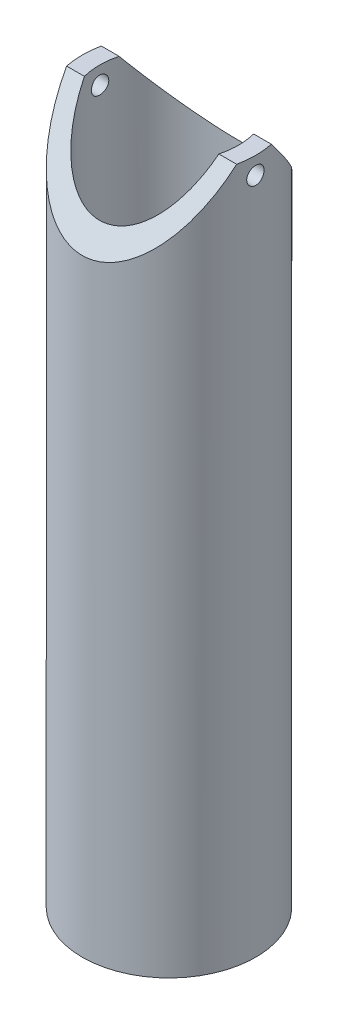
ISO-10303-21;
HEADER;
FILE_DESCRIPTION(('STEP AP214'),'2;1');
FILE_NAME('part.step','',(''),(''),'','','');
FILE_SCHEMA(('AUTOMOTIVE_DESIGN { 1 0 10303 214 1 1 1 1 }'));
ENDSEC;
DATA;
#1=APPLICATION_CONTEXT('core data for automotive mechanical design processes');
#2=APPLICATION_PROTOCOL_DEFINITION('international standard','automotive_design',2000,#1);
#3=PRODUCT_CONTEXT('',#1,'mechanical');
#4=PRODUCT('Part','Part','',(#3));
#5=PRODUCT_RELATED_PRODUCT_CATEGORY('part','',(#4));
#6=PRODUCT_DEFINITION_FORMATION('','',#4);
#7=PRODUCT_DEFINITION_CONTEXT('part definition',#1,'design');
#8=PRODUCT_DEFINITION('design','',#6,#7);
#9=PRODUCT_DEFINITION_SHAPE('','',#8);
#10=(LENGTH_UNIT() NAMED_UNIT(*) SI_UNIT(.MILLI.,.METRE.));
#11=(NAMED_UNIT(*) PLANE_ANGLE_UNIT() SI_UNIT($,.RADIAN.));
#12=(NAMED_UNIT(*) SI_UNIT($,.STERADIAN.) SOLID_ANGLE_UNIT());
#13=UNCERTAINTY_MEASURE_WITH_UNIT(LENGTH_MEASURE(1.E-05),#10,'distance_accuracy_value','');
#14=(GEOMETRIC_REPRESENTATION_CONTEXT(3) GLOBAL_UNCERTAINTY_ASSIGNED_CONTEXT((#13)) GLOBAL_UNIT_ASSIGNED_CONTEXT((#10,
#11,#12)) REPRESENTATION_CONTEXT('',''));
#15=CARTESIAN_POINT('',(0.,0.,0.));
#16=DIRECTION('',(0.,0.,1.));
#17=DIRECTION('',(1.,0.,0.));
#18=AXIS2_PLACEMENT_3D('',#15,#16,#17);
#19=CARTESIAN_POINT('',(0.,200.,0.));
#20=DIRECTION('',(0.,1.,0.));
#21=DIRECTION('',(0.,0.,1.));
#22=AXIS2_PLACEMENT_3D('',#19,#20,#21);
#23=PLANE('',#22);
#24=CARTESIAN_POINT('',(0.,200.,0.));
#25=DIRECTION('',(0.,1.,0.));
#26=DIRECTION('',(0.,0.,1.));
#27=AXIS2_PLACEMENT_3D('',#24,#25,#26);
#28=CIRCLE('',#27,25.);
#29=CARTESIAN_POINT('',(-24.4948974278317,200.,-5.));
#30=VERTEX_POINT('',#29);
#31=CARTESIAN_POINT('',(-24.4948974278318,200.,5.));
#32=VERTEX_POINT('',#31);
#33=EDGE_CURVE('E91',#30,#32,#28,.T.);
#34=ORIENTED_EDGE('',*,*,#33,.T.);
#35=DIRECTION('',(-1.,0.,0.));
#36=VECTOR('',#35,1.);
#37=CARTESIAN_POINT('',(200.,200.,5.));
#38=LINE('',#37,#36);
#39=CARTESIAN_POINT('',(-19.3649167310371,200.,5.));
#40=VERTEX_POINT('',#39);
#41=EDGE_CURVE('E100',#40,#32,#38,.T.);
#42=ORIENTED_EDGE('',*,*,#41,.F.);
#43=CARTESIAN_POINT('',(0.,200.,0.));
#44=DIRECTION('',(0.,1.,0.));
#45=DIRECTION('',(0.,0.,1.));
#46=AXIS2_PLACEMENT_3D('',#43,#44,#45);
#47=CIRCLE('',#46,20.);
#48=CARTESIAN_POINT('',(-19.3649167310371,200.,-5.));
#49=VERTEX_POINT('',#48);
#50=EDGE_CURVE('E143',#49,#40,#47,.T.);
#51=ORIENTED_EDGE('',*,*,#50,.F.);
#52=DIRECTION('',(-1.,0.,0.));
#53=VECTOR('',#52,1.);
#54=CARTESIAN_POINT('',(200.,200.,-5.));
#55=LINE('',#54,#53);
#56=EDGE_CURVE('E60',#49,#30,#55,.T.);
#57=ORIENTED_EDGE('',*,*,#56,.T.);
#58=EDGE_LOOP('',(#34,#42,#51,#57));
#59=FACE_BOUND('',#58,.T.);
#60=ADVANCED_FACE('F37',(#59),#23,.T.);
#61=CARTESIAN_POINT('',(19.3649167310371,200.,5.));
#62=VERTEX_POINT('',#61);
#63=CARTESIAN_POINT('',(19.3649167310371,200.,-5.));
#64=VERTEX_POINT('',#63);
#65=EDGE_CURVE('E111',#62,#64,#47,.T.);
#66=ORIENTED_EDGE('',*,*,#65,.F.);
#67=CARTESIAN_POINT('',(24.4948974278318,200.,5.));
#68=VERTEX_POINT('',#67);
#69=EDGE_CURVE('E68',#68,#62,#38,.T.);
#70=ORIENTED_EDGE('',*,*,#69,.F.);
#71=CARTESIAN_POINT('',(24.4948974278318,200.,-5.));
#72=VERTEX_POINT('',#71);
#73=EDGE_CURVE('E89',#68,#72,#28,.T.);
#74=ORIENTED_EDGE('',*,*,#73,.T.);
#75=EDGE_CURVE('E95',#72,#64,#55,.T.);
#76=ORIENTED_EDGE('',*,*,#75,.T.);
#77=EDGE_LOOP('',(#66,#70,#74,#76));
#78=FACE_BOUND('',#77,.T.);
#79=ADVANCED_FACE('F102',(#78),#23,.T.);
#80=CARTESIAN_POINT('',(0.,200.,0.));
#81=DIRECTION('',(0.,-1.,0.));
#82=DIRECTION('',(0.,0.,-1.));
#83=AXIS2_PLACEMENT_3D('',#80,#81,#82);
#84=CYLINDRICAL_SURFACE('',#83,25.);
#85=CARTESIAN_POINT('',(0.,0.,0.));
#86=DIRECTION('',(0.,1.,0.));
#87=DIRECTION('',(0.,0.,1.));
#88=AXIS2_PLACEMENT_3D('',#85,#86,#87);
#89=CIRCLE('',#88,25.);
#90=CARTESIAN_POINT('',(0.,0.,25.));
#91=VERTEX_POINT('',#90);
#92=EDGE_CURVE('E105',#91,#91,#89,.T.);
#93=ORIENTED_EDGE('',*,*,#92,.T.);
#94=EDGE_LOOP('',(#93));
#95=FACE_BOUND('',#94,.T.);
#96=CARTESIAN_POINT('',(0.,206.25,0.));
#97=DIRECTION('',(0.,0.624695047554424,0.78086880944303));
#98=DIRECTION('',(0.,-0.78086880944303,0.624695047554424));
#99=AXIS2_PLACEMENT_3D('',#96,#97,#98);
#100=ELLIPSE('',#99,40.0195264839553,25.);
#101=EDGE_CURVE('E92',#32,#68,#100,.T.);
#102=ORIENTED_EDGE('',*,*,#101,.F.);
#103=ORIENTED_EDGE('',*,*,#33,.F.);
#104=CARTESIAN_POINT('',(0.,206.25,0.));
#105=DIRECTION('',(0.,0.624695047554424,-0.78086880944303));
#106=DIRECTION('',(0.,-0.78086880944303,-0.624695047554424));
#107=AXIS2_PLACEMENT_3D('',#104,#105,#106);
#108=ELLIPSE('',#107,40.0195264839553,25.);
#109=EDGE_CURVE('E85',#72,#30,#108,.T.);
#110=ORIENTED_EDGE('',*,*,#109,.F.);
#111=ORIENTED_EDGE('',*,*,#73,.F.);
#112=EDGE_LOOP('',(#102,#103,#110,#111));
#113=FACE_BOUND('',#112,.T.);
#114=CARTESIAN_POINT('',(-24.8746859276655,195.,2.5));
#115=CARTESIAN_POINT('',(-24.8746875699226,195.140048910434,2.49999393348378));
#116=CARTESIAN_POINT('',(-24.8758814248555,195.28019042103,2.48819214745619));
#117=CARTESIAN_POINT('',(-24.880527188953,195.556587965734,2.44129078690891));
#118=CARTESIAN_POINT('',(-24.8839815865305,195.692839545094,2.40616553721609));
#119=CARTESIAN_POINT('',(-24.8927533261847,195.957414548045,2.31365029017232));
#120=CARTESIAN_POINT('',(-24.8980695386697,196.085742723479,2.25627379073475));
#121=CARTESIAN_POINT('',(-24.9099645142955,196.330919480729,2.12091066847776));
#122=CARTESIAN_POINT('',(-24.9165430266082,196.447770336209,2.04292813906482));
#123=CARTESIAN_POINT('',(-24.9302481677475,196.667128159144,1.86826190499677));
#124=CARTESIAN_POINT('',(-24.9373765001317,196.769587523759,1.77151854527066));
#125=CARTESIAN_POINT('',(-24.951362630893,196.956844022509,1.56220428829893));
#126=CARTESIAN_POINT('',(-24.9582204168803,197.041640348516,1.44963266726643));
#127=CARTESIAN_POINT('',(-24.9709095788901,197.191328142518,1.21156590412747));
#128=CARTESIAN_POINT('',(-24.9767387723662,197.256177496984,1.08604415632392));
#129=CARTESIAN_POINT('',(-24.9866954218943,197.363861082872,0.825824960718766));
#130=CARTESIAN_POINT('',(-24.9908229194266,197.406695850924,0.691127736670536));
#131=CARTESIAN_POINT('',(-24.9968991642756,197.468994773383,0.416861956857362));
#132=CARTESIAN_POINT('',(-24.9988551960704,197.488537081875,0.277311317578944));
#133=CARTESIAN_POINT('',(-25.0003928899673,197.503938172834,-0.00310185172236417));
#134=CARTESIAN_POINT('',(-24.9999746136318,197.499797569366,-0.143964347636159));
#135=CARTESIAN_POINT('',(-24.9968167827796,197.468013818375,-0.422472110161406));
#136=CARTESIAN_POINT('',(-24.9940855287928,197.44045471109,-0.560127074837454));
#137=CARTESIAN_POINT('',(-24.9866182316233,197.362747177633,-0.82884794876134));
#138=CARTESIAN_POINT('',(-24.9818821623988,197.312598458031,-0.959913772394329));
#139=CARTESIAN_POINT('',(-24.9709234370979,197.191043091864,-1.21200078669897));
#140=CARTESIAN_POINT('',(-24.9646981841439,197.119599256175,-1.33300392745413));
#141=CARTESIAN_POINT('',(-24.9514596129852,196.957508691659,-1.56133378293549));
#142=CARTESIAN_POINT('',(-24.9444462716703,196.866861399637,-1.66866009640207));
#143=CARTESIAN_POINT('',(-24.9303823366963,196.668464426216,-1.86708192955672));
#144=CARTESIAN_POINT('',(-24.9233317143257,196.560641638146,-1.95810436547587));
#145=CARTESIAN_POINT('',(-24.9100184982056,196.331207836973,-2.1207688383948));
#146=CARTESIAN_POINT('',(-24.9037559055991,196.20959680387,-2.19241084728223));
#147=CARTESIAN_POINT('',(-24.8927272378537,195.955982437001,-2.31428046143308));
#148=CARTESIAN_POINT('',(-24.8879614783139,195.823976918943,-2.3645035514324));
#149=CARTESIAN_POINT('',(-24.8804725467734,195.553348488463,-2.44205183909397));
#150=CARTESIAN_POINT('',(-24.8777493125442,195.414725777781,-2.46937773435759));
#151=CARTESIAN_POINT('',(-24.8746645131854,195.135439551176,-2.5002619384799));
#152=CARTESIAN_POINT('',(-24.8742927886901,194.994787449338,-2.50392249161803));
#153=CARTESIAN_POINT('',(-24.8759262838693,194.714871835443,-2.48764061717841));
#154=CARTESIAN_POINT('',(-24.8779314714265,194.575608304649,-2.46769850852439));
#155=CARTESIAN_POINT('',(-24.88408361056,194.302721044304,-2.4048629362688));
#156=CARTESIAN_POINT('',(-24.8882260500336,194.169086072263,-2.36201781797228));
#157=CARTESIAN_POINT('',(-24.8981822759699,193.910899870674,-2.25464179918986));
#158=CARTESIAN_POINT('',(-24.9039961007167,193.786348849282,-2.19011040195897));
#159=CARTESIAN_POINT('',(-24.9166646088928,193.549400064928,-2.04093750355804));
#160=CARTESIAN_POINT('',(-24.9235227703668,193.437045145084,-1.95622824960173));
#161=CARTESIAN_POINT('',(-24.9374958156297,193.228112366815,-1.76920133362793));
#162=CARTESIAN_POINT('',(-24.9446107057716,193.13153489915,-1.66688323562033));
#163=CARTESIAN_POINT('',(-24.9583261962325,192.956545916505,-1.44709951056618));
#164=CARTESIAN_POINT('',(-24.9649248513869,192.878201101034,-1.32958063992362));
#165=CARTESIAN_POINT('',(-24.9768360526658,192.742360328734,-1.08299429354283));
#166=CARTESIAN_POINT('',(-24.9821486164123,192.684864086232,-0.953926976074065));
#167=CARTESIAN_POINT('',(-24.9908802603501,192.592465580862,-0.68814031608204));
#168=CARTESIAN_POINT('',(-24.9943027151412,192.557523031687,-0.5514350941249));
#169=CARTESIAN_POINT('',(-24.9988823653412,192.51109232605,-0.274062034959198));
#170=CARTESIAN_POINT('',(-25.0000396244141,192.499603510415,-0.133394309230542));
#171=CARTESIAN_POINT('',(-24.9999584578317,192.5004156661,0.147255560189371));
#172=CARTESIAN_POINT('',(-24.9987304594167,192.512613092092,0.287238018061326));
#173=CARTESIAN_POINT('',(-24.9940373394398,192.560234364142,0.563154720890912));
#174=CARTESIAN_POINT('',(-24.9905722161218,192.595658228432,0.699088962670918));
#175=CARTESIAN_POINT('',(-24.981793095349,192.688698143482,0.963049771919364));
#176=CARTESIAN_POINT('',(-24.9764793500812,192.746311167335,1.09107741519383));
#177=CARTESIAN_POINT('',(-24.9645953104074,192.882082922292,1.335661500387));
#178=CARTESIAN_POINT('',(-24.9580250233539,192.960241533178,1.45221800942141));
#179=CARTESIAN_POINT('',(-24.9443296167264,193.135274047559,1.67108181106736));
#180=CARTESIAN_POINT('',(-24.9372022865175,193.232225040612,1.77332731554836));
#181=CARTESIAN_POINT('',(-24.9232147692415,193.441938378864,1.96014439848287));
#182=CARTESIAN_POINT('',(-24.9163546466944,193.554704512923,2.04471172961963));
#183=CARTESIAN_POINT('',(-24.903659585265,193.7931608548,2.19394160106014));
#184=CARTESIAN_POINT('',(-24.8978272981327,193.91888320331,2.2585529699871));
#185=CARTESIAN_POINT('',(-24.8878798690615,194.179370728116,2.36566177024693));
#186=CARTESIAN_POINT('',(-24.883762791334,194.314125509814,2.40818414472465));
#187=CARTESIAN_POINT('',(-24.8787501884536,194.541369352248,2.45930422083383));
#188=CARTESIAN_POINT('',(-24.8772332983924,194.632405628266,2.47454428099556));
#189=CARTESIAN_POINT('',(-24.8752006294416,194.815614557606,2.49489414651279));
#190=CARTESIAN_POINT('',(-24.8746848463496,194.907787206156,2.50000399439316));
#191=CARTESIAN_POINT('',(-24.8746859276655,195.,2.5));
#192=B_SPLINE_CURVE_WITH_KNOTS('',3,(#114,#115,#116,#117,#118,#119,#120,#121,#122,#123,#124,
#125,#126,#127,#128,#129,#130,#131,#132,#133,#134,#135,#136,#137,#138,#139,#140,#141,#142,#143,
#144,#145,#146,#147,#148,#149,#150,#151,#152,#153,#154,#155,#156,#157,#158,#159,#160,#161,#162,
#163,#164,#165,#166,#167,#168,#169,#170,#171,#172,#173,#174,#175,#176,#177,#178,#179,#180,#181,
#182,#183,#184,#185,#186,#187,#188,#189,#190,#191),.UNSPECIFIED.,.T.,.F.,(4,2,2,2,2,2,2,2,2,2,2,
2,2,2,2,2,2,2,2,2,2,2,2,2,2,2,2,2,2,2,2,2,2,2,2,2,2,2,4),(0.,0.419809986091141,0.84008287955443,
1.26010122749368,1.6800362010533,2.10132903824809,2.52264114638133,2.9448367492823,
3.36702206019488,3.78778677246125,4.20854057495581,4.62779079546655,5.04704646202436,
5.46703863666035,5.88704313046322,6.30888562712503,6.73072873568908,7.15266072794836,
7.57457986487583,7.99467490769412,8.41476427417178,8.83397036761317,9.25318606402618,
9.67382974529297,10.0944838430801,10.516653420453,10.9388172129501,11.360224817359,
11.7816205778287,12.2011783367121,12.6207364249165,13.0402372998812,13.45973572027,
13.8809928759497,14.3023511258632,14.7247810267619,15.14673287235,15.4231506901512,
15.6995673475954),.UNSPECIFIED.);
#193=CARTESIAN_POINT('',(-24.8746859276655,195.,2.5));
#194=VERTEX_POINT('',#193);
#195=EDGE_CURVE('E132',#194,#194,#192,.T.);
#196=ORIENTED_EDGE('',*,*,#195,.F.);
#197=EDGE_LOOP('',(#196));
#198=FACE_BOUND('',#197,.T.);
#199=CARTESIAN_POINT('',(24.8746859276655,195.,2.5));
#200=CARTESIAN_POINT('',(24.8746875699226,194.859951089566,2.49999393348378));
#201=CARTESIAN_POINT('',(24.8758814248555,194.71980957897,2.48819214745619));
#202=CARTESIAN_POINT('',(24.880527188953,194.443412034266,2.44129078690891));
#203=CARTESIAN_POINT('',(24.8839815865305,194.307160454906,2.40616553721609));
#204=CARTESIAN_POINT('',(24.8927533261847,194.042585451955,2.31365029017231));
#205=CARTESIAN_POINT('',(24.8980695386697,193.914257276521,2.25627379073473));
#206=CARTESIAN_POINT('',(24.9099645142955,193.669080519271,2.12091066847773));
#207=CARTESIAN_POINT('',(24.9165430266082,193.552229663791,2.04292813906481));
#208=CARTESIAN_POINT('',(24.9302481677475,193.332871840856,1.86826190499676));
#209=CARTESIAN_POINT('',(24.9373765001317,193.230412476241,1.77151854527063));
#210=CARTESIAN_POINT('',(24.951362630893,193.043155977491,1.56220428829889));
#211=CARTESIAN_POINT('',(24.9582204168803,192.958359651484,1.44963266726641));
#212=CARTESIAN_POINT('',(24.9709095788901,192.808671857482,1.21156590412747));
#213=CARTESIAN_POINT('',(24.9767387723662,192.743822503016,1.08604415632392));
#214=CARTESIAN_POINT('',(24.9866954218943,192.636138917128,0.825824960718767));
#215=CARTESIAN_POINT('',(24.9908229194266,192.593304149076,0.691127736670536));
#216=CARTESIAN_POINT('',(24.9968991642756,192.531005226617,0.416861956857362));
#217=CARTESIAN_POINT('',(24.9988551960704,192.511462918125,0.277311317578944));
#218=CARTESIAN_POINT('',(25.0003928899673,192.496061827166,-0.00310185172236425));
#219=CARTESIAN_POINT('',(24.9999746136318,192.500202430634,-0.143964347636159));
#220=CARTESIAN_POINT('',(24.9968167827796,192.531986181625,-0.422472110161398));
#221=CARTESIAN_POINT('',(24.9940855287928,192.55954528891,-0.560127074837438));
#222=CARTESIAN_POINT('',(24.9866182316233,192.637252822367,-0.828847948761325));
#223=CARTESIAN_POINT('',(24.9818821623988,192.687401541969,-0.959913772394322));
#224=CARTESIAN_POINT('',(24.9709234370979,192.808956908136,-1.21200078669897));
#225=CARTESIAN_POINT('',(24.9646981841439,192.880400743825,-1.33300392745413));
#226=CARTESIAN_POINT('',(24.9514596129852,193.042491308341,-1.56133378293549));
#227=CARTESIAN_POINT('',(24.9444462716703,193.133138600363,-1.66866009640207));
#228=CARTESIAN_POINT('',(24.9303823366963,193.331535573784,-1.86708192955672));
#229=CARTESIAN_POINT('',(24.9233317143257,193.439358361854,-1.95810436547585));
#230=CARTESIAN_POINT('',(24.9100184982056,193.668792163027,-2.12076883839479));
#231=CARTESIAN_POINT('',(24.9037559055991,193.79040319613,-2.19241084728222));
#232=CARTESIAN_POINT('',(24.8927272378537,194.044017562999,-2.31428046143308));
#233=CARTESIAN_POINT('',(24.8879614783139,194.176023081057,-2.3645035514324));
#234=CARTESIAN_POINT('',(24.8804725467734,194.446651511537,-2.44205183909397));
#235=CARTESIAN_POINT('',(24.8777493125442,194.585274222219,-2.46937773435759));
#236=CARTESIAN_POINT('',(24.8746645131854,194.864560448824,-2.5002619384799));
#237=CARTESIAN_POINT('',(24.8742927886901,195.005212550662,-2.50392249161803));
#238=CARTESIAN_POINT('',(24.8759262838693,195.285128164557,-2.4876406171784));
#239=CARTESIAN_POINT('',(24.8779314714265,195.424391695351,-2.46769850852438));
#240=CARTESIAN_POINT('',(24.88408361056,195.697278955696,-2.4048629362688));
#241=CARTESIAN_POINT('',(24.8882260500336,195.830913927737,-2.36201781797227));
#242=CARTESIAN_POINT('',(24.8981822759699,196.089100129326,-2.25464179918984));
#243=CARTESIAN_POINT('',(24.9039961007167,196.213651150718,-2.19011040195896));
#244=CARTESIAN_POINT('',(24.9166646088928,196.450599935072,-2.04093750355804));
#245=CARTESIAN_POINT('',(24.9235227703668,196.562954854916,-1.95622824960173));
#246=CARTESIAN_POINT('',(24.9374958156297,196.771887633185,-1.76920133362793));
#247=CARTESIAN_POINT('',(24.9446107057716,196.86846510085,-1.66688323562033));
#248=CARTESIAN_POINT('',(24.9583261962325,197.043454083495,-1.44709951056617));
#249=CARTESIAN_POINT('',(24.9649248513869,197.121798898966,-1.32958063992362));
#250=CARTESIAN_POINT('',(24.9768360526658,197.257639671266,-1.08299429354282));
#251=CARTESIAN_POINT('',(24.9821486164123,197.315135913768,-0.953926976074061));
#252=CARTESIAN_POINT('',(24.9908802603501,197.407534419138,-0.688140316082041));
#253=CARTESIAN_POINT('',(24.9943027151412,197.442476968313,-0.551435094124901));
#254=CARTESIAN_POINT('',(24.9988823653412,197.48890767395,-0.274062034959198));
#255=CARTESIAN_POINT('',(25.0000396244141,197.500396489585,-0.133394309230542));
#256=CARTESIAN_POINT('',(24.9999584578317,197.4995843339,0.147255560189371));
#257=CARTESIAN_POINT('',(24.9987304594167,197.487386907908,0.287238018061326));
#258=CARTESIAN_POINT('',(24.9940373394398,197.439765635858,0.563154720890913));
#259=CARTESIAN_POINT('',(24.9905722161218,197.404341771568,0.699088962670918));
#260=CARTESIAN_POINT('',(24.981793095349,197.311301856518,0.963049771919363));
#261=CARTESIAN_POINT('',(24.9764793500812,197.253688832665,1.09107741519383));
#262=CARTESIAN_POINT('',(24.9645953104074,197.117917077708,1.335661500387));
#263=CARTESIAN_POINT('',(24.9580250233539,197.039758466822,1.45221800942141));
#264=CARTESIAN_POINT('',(24.9443296167264,196.864725952441,1.67108181106735));
#265=CARTESIAN_POINT('',(24.9372022865175,196.767774959388,1.77332731554835));
#266=CARTESIAN_POINT('',(24.9232147692415,196.558061621136,1.96014439848286));
#267=CARTESIAN_POINT('',(24.9163546466944,196.445295487077,2.04471172961963));
#268=CARTESIAN_POINT('',(24.903659585265,196.2068391452,2.19394160106014));
#269=CARTESIAN_POINT('',(24.8978272981327,196.08111679669,2.2585529699871));
#270=CARTESIAN_POINT('',(24.8878798690615,195.820629271884,2.36566177024693));
#271=CARTESIAN_POINT('',(24.883762791334,195.685874490186,2.40818414472465));
#272=CARTESIAN_POINT('',(24.8787501884536,195.458630647752,2.45930422083383));
#273=CARTESIAN_POINT('',(24.8772332983924,195.367594371734,2.47454428099556));
#274=CARTESIAN_POINT('',(24.8752006294416,195.184385442394,2.49489414651279));
#275=CARTESIAN_POINT('',(24.8746848463496,195.092212793844,2.50000399439316));
#276=CARTESIAN_POINT('',(24.8746859276655,195.,2.5));
#277=B_SPLINE_CURVE_WITH_KNOTS('',3,(#199,#200,#201,#202,#203,#204,#205,#206,#207,#208,#209,
#210,#211,#212,#213,#214,#215,#216,#217,#218,#219,#220,#221,#222,#223,#224,#225,#226,#227,#228,
#229,#230,#231,#232,#233,#234,#235,#236,#237,#238,#239,#240,#241,#242,#243,#244,#245,#246,#247,
#248,#249,#250,#251,#252,#253,#254,#255,#256,#257,#258,#259,#260,#261,#262,#263,#264,#265,#266,
#267,#268,#269,#270,#271,#272,#273,#274,#275,#276),.UNSPECIFIED.,.T.,.F.,(4,2,2,2,2,2,2,2,2,2,2,
2,2,2,2,2,2,2,2,2,2,2,2,2,2,2,2,2,2,2,2,2,2,2,2,2,2,2,4),(0.,0.419809986091141,0.84008287955443,
1.26010122749375,1.6800362010533,2.10132903824817,2.52264114638133,2.9448367492823,
3.36702206019488,3.78778677246125,4.20854057495581,4.62779079546653,5.04704646202436,
5.46703863666035,5.88704313046322,6.30888562712502,6.73072873568907,7.15266072794836,
7.57457986487583,7.99467490769417,8.41476427417177,8.8339703676132,9.25318606402617,
9.67382974529297,10.0944838430801,10.516653420453,10.9388172129501,11.360224817359,
11.7816205778287,12.2011783367121,12.6207364249165,13.0402372998812,13.45973572027,
13.8809928759497,14.3023511258632,14.7247810267619,15.14673287235,15.4231506901512,
15.6995673475954),.UNSPECIFIED.);
#278=CARTESIAN_POINT('',(24.8746859276655,195.,2.5));
#279=VERTEX_POINT('',#278);
#280=EDGE_CURVE('E138',#279,#279,#277,.T.);
#281=ORIENTED_EDGE('',*,*,#280,.F.);
#282=EDGE_LOOP('',(#281));
#283=FACE_BOUND('',#282,.T.);
#284=ADVANCED_FACE('F39',(#95,#113,#198,#283),#84,.T.);
#285=CARTESIAN_POINT('',(0.,200.,0.));
#286=DIRECTION('',(0.,-1.,0.));
#287=DIRECTION('',(0.,0.,-1.));
#288=AXIS2_PLACEMENT_3D('',#285,#286,#287);
#289=CYLINDRICAL_SURFACE('',#288,20.);
#290=CARTESIAN_POINT('',(-19.8431348329844,195.,2.5));
#291=CARTESIAN_POINT('',(-19.8431368414673,195.1398362838,2.49999405483338));
#292=CARTESIAN_POINT('',(-19.8446289499888,195.279759964931,2.4882278990166));
#293=CARTESIAN_POINT('',(-19.8504339085542,195.555713225428,2.44147641371667));
#294=CARTESIAN_POINT('',(-19.8547497060959,195.691738580502,2.40646682109081));
#295=CARTESIAN_POINT('',(-19.8657057380876,195.955859882108,2.31427669282774));
#296=CARTESIAN_POINT('',(-19.8723443946258,196.083961142116,2.25711120479873));
#297=CARTESIAN_POINT('',(-19.8871962351098,196.328728451825,2.12226419842907));
#298=CARTESIAN_POINT('',(-19.8954091498188,196.445396451744,2.04458618737468));
#299=CARTESIAN_POINT('',(-19.9125355924631,196.664662247121,1.87045345026456));
#300=CARTESIAN_POINT('',(-19.9214524170269,196.767186802319,1.77390681502434));
#301=CARTESIAN_POINT('',(-19.9389523287519,196.954622768939,1.5649752606712));
#302=CARTESIAN_POINT('',(-19.9475353992921,197.039533304095,1.45258955405802));
#303=CARTESIAN_POINT('',(-19.96343444613,197.189593579506,1.21470983067597));
#304=CARTESIAN_POINT('',(-19.9707461384685,197.2546770451,1.08917369556111));
#305=CARTESIAN_POINT('',(-19.9832423695448,197.362811199941,0.828846718055915));
#306=CARTESIAN_POINT('',(-19.9884269872296,197.405862706927,0.69405621936091));
#307=CARTESIAN_POINT('',(-19.9960616870624,197.468492068334,0.419795687751121));
#308=CARTESIAN_POINT('',(-19.9985259483594,197.488191678524,0.280353859663384));
#309=CARTESIAN_POINT('',(-20.0004906972921,197.503935385037,0.000123200686550425));
#310=CARTESIAN_POINT('',(-19.9999913015208,197.499980411953,-0.140665576994768));
#311=CARTESIAN_POINT('',(-19.9960964777001,197.468624797243,-0.418765268974543));
#312=CARTESIAN_POINT('',(-19.9927172245573,197.441355101519,-0.556091205764446));
#313=CARTESIAN_POINT('',(-19.9834605594233,197.36434882337,-0.824202163905365));
#314=CARTESIAN_POINT('',(-19.9775830999405,197.314611813833,-0.954987060856192));
#315=CARTESIAN_POINT('',(-19.9639625780791,197.193943507216,-1.20670881543863));
#316=CARTESIAN_POINT('',(-19.9562145384324,197.12295554227,-1.32761822784052));
#317=CARTESIAN_POINT('',(-19.9397196906528,196.961841637784,-1.55585745230648));
#318=CARTESIAN_POINT('',(-19.9309728367226,196.871714820531,-1.66318664121735));
#319=CARTESIAN_POINT('',(-19.9133886752351,196.674148181402,-1.86198803077294));
#320=CARTESIAN_POINT('',(-19.9045511580473,196.566594240453,-1.953346839996));
#321=CARTESIAN_POINT('',(-19.8878407194058,196.337618443218,-2.11673285062511));
#322=CARTESIAN_POINT('',(-19.8799678009758,196.216196543462,-2.18875999143509));
#323=CARTESIAN_POINT('',(-19.8660780261272,195.962830504438,-2.31144457358273));
#324=CARTESIAN_POINT('',(-19.8600619590813,195.830881920047,-2.36209292986232));
#325=CARTESIAN_POINT('',(-19.8505824249596,195.560260546473,-2.44048165446809));
#326=CARTESIAN_POINT('',(-19.847118834867,195.421588081691,-2.46822312679962));
#327=CARTESIAN_POINT('',(-19.8431588878405,195.142456818,-2.49986043190861));
#328=CARTESIAN_POINT('',(-19.8426426744238,195.002016376911,-2.50391584199829));
#329=CARTESIAN_POINT('',(-19.8445834111965,194.722458070335,-2.48848695323056));
#330=CARTESIAN_POINT('',(-19.8470402980145,194.583340176721,-2.46900315610981));
#331=CARTESIAN_POINT('',(-19.8546322848399,194.310854236422,-2.40718328579773));
#332=CARTESIAN_POINT('',(-19.8597583269466,194.17746838481,-2.36492448374606));
#333=CARTESIAN_POINT('',(-19.8721036997081,193.919675845147,-2.25883371911614));
#334=CARTESIAN_POINT('',(-19.8793231039076,193.795269472759,-2.19500099858124));
#335=CARTESIAN_POINT('',(-19.8950893135323,193.558245356187,-2.04718202215493));
#336=CARTESIAN_POINT('',(-19.9036429273708,193.445693334686,-1.96309111957712));
#337=CARTESIAN_POINT('',(-19.9210923955102,193.236243446065,-1.77729074236897));
#338=CARTESIAN_POINT('',(-19.9299882631129,193.139346188132,-1.67558058242549));
#339=CARTESIAN_POINT('',(-19.9471808868696,192.963395812666,-1.45673177555852));
#340=CARTESIAN_POINT('',(-19.9554739391252,192.884447553205,-1.33950849211704));
#341=CARTESIAN_POINT('',(-19.9704711303161,192.747361782366,-1.0933725816818));
#342=CARTESIAN_POINT('',(-19.9771753012772,192.689223851519,-0.964460190368329));
#343=CARTESIAN_POINT('',(-19.9882229065319,192.595582213092,-0.69895385913946));
#344=CARTESIAN_POINT('',(-19.992572656877,192.560017903968,-0.562381566511787));
#345=CARTESIAN_POINT('',(-19.9984475467757,192.512335910773,-0.28514605727797));
#346=CARTESIAN_POINT('',(-19.9999728137019,192.500217169401,-0.144483025438115));
#347=CARTESIAN_POINT('',(-20.0000262801365,192.499790077708,0.135917183343772));
#348=CARTESIAN_POINT('',(-19.998574831678,192.511320039432,0.275654137714715));
#349=CARTESIAN_POINT('',(-19.9928784115798,192.557520613431,0.55118774145261));
#350=CARTESIAN_POINT('',(-19.9886334418829,192.592191209612,0.686984393559868));
#351=CARTESIAN_POINT('',(-19.9778248521189,192.68363811435,0.950761442987276));
#352=CARTESIAN_POINT('',(-19.9712620443393,192.740406679373,1.07874456015945));
#353=CARTESIAN_POINT('',(-19.9565444760682,192.874421314608,1.32339333714412));
#354=CARTESIAN_POINT('',(-19.9483896966512,192.951667628263,1.44005886238843));
#355=CARTESIAN_POINT('',(-19.9313319392356,193.125043215335,1.65958676796214));
#356=CARTESIAN_POINT('',(-19.9224244127137,193.22129279352,1.76235378783277));
#357=CARTESIAN_POINT('',(-19.9049015902109,193.429692944032,1.95034111882087));
#358=CARTESIAN_POINT('',(-19.8962863639518,193.541847277503,2.03555726779919));
#359=CARTESIAN_POINT('',(-19.8802881136638,193.779369922687,2.18630524251151));
#360=CARTESIAN_POINT('',(-19.8729099764648,193.904787589893,2.2517597831474));
#361=CARTESIAN_POINT('',(-19.8602785801803,194.164856740553,2.36058528832415));
#362=CARTESIAN_POINT('',(-19.8550230113382,194.299497999292,2.40398027122394));
#363=CARTESIAN_POINT('',(-19.8485078683333,194.529029987049,2.45706589624051));
#364=CARTESIAN_POINT('',(-19.8465030152112,194.62247295154,2.47314303101112));
#365=CARTESIAN_POINT('',(-19.8438158223071,194.810597249965,2.49461205590498));
#366=CARTESIAN_POINT('',(-19.8431334724909,194.905278574498,2.50000402709971));
#367=CARTESIAN_POINT('',(-19.8431348329844,195.,2.5));
#368=B_SPLINE_CURVE_WITH_KNOTS('',3,(#290,#291,#292,#293,#294,#295,#296,#297,#298,#299,#300,
#301,#302,#303,#304,#305,#306,#307,#308,#309,#310,#311,#312,#313,#314,#315,#316,#317,#318,#319,
#320,#321,#322,#323,#324,#325,#326,#327,#328,#329,#330,#331,#332,#333,#334,#335,#336,#337,#338,
#339,#340,#341,#342,#343,#344,#345,#346,#347,#348,#349,#350,#351,#352,#353,#354,#355,#356,#357,
#358,#359,#360,#361,#362,#363,#364,#365,#366,#367),.UNSPECIFIED.,.T.,.F.,(4,2,2,2,2,2,2,2,2,2,2,
2,2,2,2,2,2,2,2,2,2,2,2,2,2,2,2,2,2,2,2,2,2,2,2,2,2,2,4),(0.,0.41916281749168,0.838763876176496,
1.25808045260529,1.6773253795302,2.09866577551479,2.52002712744993,2.94278186148154,
3.36552090342242,3.7860459694387,4.20655449172521,4.62471664935451,5.04288675674201,
5.46218204415216,5.88149656471518,6.30367697380184,6.72585870621838,7.14821966741419,
7.570560271586,7.990052178083,8.40953514329532,8.82760376295144,9.24568707214264,
9.66597819546522,10.0862856699722,10.5089888589475,10.9316835271129,11.3532385678735,
11.7747745977522,12.1934381629067,12.612101436892,13.030618135465,13.4491398096666,
13.8704012889325,14.2917625544224,14.7147509770793,15.1372778598594,15.4212098963687,
15.7051397785939),.UNSPECIFIED.);
#369=CARTESIAN_POINT('',(-19.8431348329844,195.,2.5));
#370=VERTEX_POINT('',#369);
#371=EDGE_CURVE('E112',#370,#370,#368,.T.);
#372=ORIENTED_EDGE('',*,*,#371,.T.);
#373=EDGE_LOOP('',(#372));
#374=FACE_BOUND('',#373,.T.);
#375=CARTESIAN_POINT('',(0.,0.,0.));
#376=DIRECTION('',(0.,1.,0.));
#377=DIRECTION('',(0.,0.,1.));
#378=AXIS2_PLACEMENT_3D('',#375,#376,#377);
#379=CIRCLE('',#378,20.);
#380=CARTESIAN_POINT('',(0.,0.,20.));
#381=VERTEX_POINT('',#380);
#382=EDGE_CURVE('E108',#381,#381,#379,.T.);
#383=ORIENTED_EDGE('',*,*,#382,.F.);
#384=EDGE_LOOP('',(#383));
#385=FACE_BOUND('',#384,.T.);
#386=ORIENTED_EDGE('',*,*,#50,.T.);
#387=CARTESIAN_POINT('',(0.,206.25,0.));
#388=DIRECTION('',(0.,0.624695047554424,0.78086880944303));
#389=DIRECTION('',(0.,-0.78086880944303,0.624695047554424));
#390=AXIS2_PLACEMENT_3D('',#387,#388,#389);
#391=ELLIPSE('',#390,32.0156211871642,20.);
#392=EDGE_CURVE('E11',#40,#62,#391,.T.);
#393=ORIENTED_EDGE('',*,*,#392,.T.);
#394=ORIENTED_EDGE('',*,*,#65,.T.);
#395=CARTESIAN_POINT('',(0.,206.25,0.));
#396=DIRECTION('',(0.,0.624695047554424,-0.78086880944303));
#397=DIRECTION('',(0.,-0.78086880944303,-0.624695047554424));
#398=AXIS2_PLACEMENT_3D('',#395,#396,#397);
#399=ELLIPSE('',#398,32.0156211871642,20.);
#400=EDGE_CURVE('E52',#64,#49,#399,.T.);
#401=ORIENTED_EDGE('',*,*,#400,.T.);
#402=EDGE_LOOP('',(#386,#393,#394,#401));
#403=FACE_BOUND('',#402,.T.);
#404=CARTESIAN_POINT('',(19.8431348329844,195.,2.5));
#405=CARTESIAN_POINT('',(19.8431368414673,194.8601637162,2.49999405483338));
#406=CARTESIAN_POINT('',(19.8446289499888,194.720240035069,2.4882278990166));
#407=CARTESIAN_POINT('',(19.8504339085542,194.444286774572,2.44147641371667));
#408=CARTESIAN_POINT('',(19.8547497060959,194.308261419498,2.40646682109081));
#409=CARTESIAN_POINT('',(19.8657057380876,194.044140117892,2.31427669282774));
#410=CARTESIAN_POINT('',(19.8723443946258,193.916038857884,2.25711120479873));
#411=CARTESIAN_POINT('',(19.8871962351098,193.671271548175,2.12226419842907));
#412=CARTESIAN_POINT('',(19.8954091498188,193.554603548256,2.04458618737469));
#413=CARTESIAN_POINT('',(19.9125355924631,193.335337752879,1.87045345026457));
#414=CARTESIAN_POINT('',(19.9214524170269,193.232813197681,1.77390681502435));
#415=CARTESIAN_POINT('',(19.9389523287519,193.045377231061,1.5649752606712));
#416=CARTESIAN_POINT('',(19.9475353992921,192.960466695905,1.45258955405803));
#417=CARTESIAN_POINT('',(19.96343444613,192.810406420494,1.21470983067598));
#418=CARTESIAN_POINT('',(19.9707461384685,192.7453229549,1.08917369556111));
#419=CARTESIAN_POINT('',(19.9832423695448,192.637188800059,0.828846718055915));
#420=CARTESIAN_POINT('',(19.9884269872296,192.594137293073,0.694056219360909));
#421=CARTESIAN_POINT('',(19.9960616870624,192.531507931666,0.419795687751121));
#422=CARTESIAN_POINT('',(19.9985259483594,192.511808321476,0.280353859663385));
#423=CARTESIAN_POINT('',(20.0004906972921,192.496064614963,0.000123200686551428));
#424=CARTESIAN_POINT('',(19.9999913015208,192.500019588047,-0.140665576994767));
#425=CARTESIAN_POINT('',(19.9960964777001,192.531375202757,-0.418765268974543));
#426=CARTESIAN_POINT('',(19.9927172245573,192.558644898481,-0.556091205764446));
#427=CARTESIAN_POINT('',(19.9834605594233,192.63565117663,-0.824202163905365));
#428=CARTESIAN_POINT('',(19.9775830999405,192.685388186167,-0.954987060856192));
#429=CARTESIAN_POINT('',(19.9639625780791,192.806056492784,-1.20670881543863));
#430=CARTESIAN_POINT('',(19.9562145384324,192.87704445773,-1.32761822784052));
#431=CARTESIAN_POINT('',(19.9397196906528,193.038158362216,-1.55585745230648));
#432=CARTESIAN_POINT('',(19.9309728367226,193.128285179469,-1.66318664121735));
#433=CARTESIAN_POINT('',(19.9133886752351,193.325851818598,-1.86198803077294));
#434=CARTESIAN_POINT('',(19.9045511580473,193.433405759547,-1.953346839996));
#435=CARTESIAN_POINT('',(19.8878407194058,193.662381556782,-2.11673285062511));
#436=CARTESIAN_POINT('',(19.8799678009758,193.783803456538,-2.18875999143509));
#437=CARTESIAN_POINT('',(19.8660780261272,194.037169495562,-2.31144457358273));
#438=CARTESIAN_POINT('',(19.8600619590813,194.169118079953,-2.36209292986232));
#439=CARTESIAN_POINT('',(19.8505824249596,194.439739453527,-2.44048165446809));
#440=CARTESIAN_POINT('',(19.847118834867,194.578411918309,-2.46822312679962));
#441=CARTESIAN_POINT('',(19.8431588878405,194.857543182,-2.49986043190861));
#442=CARTESIAN_POINT('',(19.8426426744238,194.997983623089,-2.50391584199829));
#443=CARTESIAN_POINT('',(19.8445834111965,195.277541929665,-2.48848695323056));
#444=CARTESIAN_POINT('',(19.8470402980145,195.416659823279,-2.4690031561098));
#445=CARTESIAN_POINT('',(19.8546322848399,195.689145763578,-2.40718328579772));
#446=CARTESIAN_POINT('',(19.8597583269466,195.82253161519,-2.36492448374605));
#447=CARTESIAN_POINT('',(19.8721036997081,196.080324154853,-2.25883371911612));
#448=CARTESIAN_POINT('',(19.8793231039076,196.204730527241,-2.19500099858122));
#449=CARTESIAN_POINT('',(19.8950893135323,196.441754643813,-2.04718202215493));
#450=CARTESIAN_POINT('',(19.9036429273708,196.554306665314,-1.96309111957712));
#451=CARTESIAN_POINT('',(19.9210923955102,196.763756553935,-1.77729074236897));
#452=CARTESIAN_POINT('',(19.9299882631129,196.860653811868,-1.67558058242549));
#453=CARTESIAN_POINT('',(19.9471808868696,197.036604187334,-1.45673177555852));
#454=CARTESIAN_POINT('',(19.9554739391252,197.115552446795,-1.33950849211704));
#455=CARTESIAN_POINT('',(19.9704711303161,197.252638217634,-1.0933725816818));
#456=CARTESIAN_POINT('',(19.9771753012772,197.310776148481,-0.964460190368329));
#457=CARTESIAN_POINT('',(19.9882229065319,197.404417786908,-0.69895385913946));
#458=CARTESIAN_POINT('',(19.992572656877,197.439982096032,-0.562381566511787));
#459=CARTESIAN_POINT('',(19.9984475467757,197.487664089227,-0.28514605727797));
#460=CARTESIAN_POINT('',(19.9999728137019,197.499782830599,-0.144483025438114));
#461=CARTESIAN_POINT('',(20.0000262801365,197.500209922292,0.135917183343772));
#462=CARTESIAN_POINT('',(19.998574831678,197.488679960568,0.275654137714715));
#463=CARTESIAN_POINT('',(19.9928784115798,197.442479386569,0.55118774145261));
#464=CARTESIAN_POINT('',(19.9886334418829,197.407808790388,0.68698439355987));
#465=CARTESIAN_POINT('',(19.9778248521189,197.31636188565,0.950761442987281));
#466=CARTESIAN_POINT('',(19.9712620443393,197.259593320627,1.07874456015946));
#467=CARTESIAN_POINT('',(19.9565444760682,197.125578685392,1.32339333714413));
#468=CARTESIAN_POINT('',(19.9483896966512,197.048332371737,1.44005886238843));
#469=CARTESIAN_POINT('',(19.9313319392356,196.874956784665,1.65958676796214));
#470=CARTESIAN_POINT('',(19.9224244127137,196.77870720648,1.76235378783276));
#471=CARTESIAN_POINT('',(19.9049015902109,196.570307055968,1.95034111882086));
#472=CARTESIAN_POINT('',(19.8962863639518,196.458152722497,2.03555726779919));
#473=CARTESIAN_POINT('',(19.8802881136638,196.220630077313,2.18630524251151));
#474=CARTESIAN_POINT('',(19.8729099764648,196.095212410107,2.2517597831474));
#475=CARTESIAN_POINT('',(19.8602785801803,195.835143259447,2.36058528832415));
#476=CARTESIAN_POINT('',(19.8550230113382,195.700502000708,2.40398027122394));
#477=CARTESIAN_POINT('',(19.8485078683333,195.470970012951,2.45706589624051));
#478=CARTESIAN_POINT('',(19.8465030152112,195.37752704846,2.47314303101112));
#479=CARTESIAN_POINT('',(19.8438158223071,195.189402750035,2.49461205590498));
#480=CARTESIAN_POINT('',(19.8431334724909,195.094721425502,2.50000402709971));
#481=CARTESIAN_POINT('',(19.8431348329844,195.,2.5));
#482=B_SPLINE_CURVE_WITH_KNOTS('',3,(#404,#405,#406,#407,#408,#409,#410,#411,#412,#413,#414,
#415,#416,#417,#418,#419,#420,#421,#422,#423,#424,#425,#426,#427,#428,#429,#430,#431,#432,#433,
#434,#435,#436,#437,#438,#439,#440,#441,#442,#443,#444,#445,#446,#447,#448,#449,#450,#451,#452,
#453,#454,#455,#456,#457,#458,#459,#460,#461,#462,#463,#464,#465,#466,#467,#468,#469,#470,#471,
#472,#473,#474,#475,#476,#477,#478,#479,#480,#481),.UNSPECIFIED.,.T.,.F.,(4,2,2,2,2,2,2,2,2,2,2,
2,2,2,2,2,2,2,2,2,2,2,2,2,2,2,2,2,2,2,2,2,2,2,2,2,2,2,4),(0.,0.41916281749168,0.838763876176496,
1.25808045260529,1.6773253795302,2.09866577551476,2.52002712744993,2.94278186148154,
3.36552090342242,3.7860459694387,4.20655449172521,4.62471664935451,5.04288675674201,
5.46218204415216,5.88149656471518,6.30367697380184,6.72585870621838,7.14821966741419,
7.570560271586,7.990052178083,8.40953514329532,8.82760376295152,9.24568707214264,
9.66597819546522,10.0862856699722,10.5089888589475,10.9316835271129,11.3532385678735,
11.7747745977522,12.1934381629067,12.612101436892,13.030618135465,13.4491398096666,
13.8704012889325,14.2917625544224,14.7147509770793,15.1372778598594,15.4212098963687,
15.7051397785939),.UNSPECIFIED.);
#483=CARTESIAN_POINT('',(19.8431348329844,195.,2.5));
#484=VERTEX_POINT('',#483);
#485=EDGE_CURVE('E42',#484,#484,#482,.T.);
#486=ORIENTED_EDGE('',*,*,#485,.T.);
#487=EDGE_LOOP('',(#486));
#488=FACE_BOUND('',#487,.T.);
#489=ADVANCED_FACE('F117',(#374,#385,#403,#488),#289,.F.);
#490=CARTESIAN_POINT('',(0.,0.,0.));
#491=DIRECTION('',(0.,1.,0.));
#492=DIRECTION('',(0.,0.,1.));
#493=AXIS2_PLACEMENT_3D('',#490,#491,#492);
#494=PLANE('',#493);
#495=ORIENTED_EDGE('',*,*,#92,.F.);
#496=EDGE_LOOP('',(#495));
#497=FACE_BOUND('',#496,.T.);
#498=ORIENTED_EDGE('',*,*,#382,.T.);
#499=EDGE_LOOP('',(#498));
#500=FACE_BOUND('',#499,.T.);
#501=ADVANCED_FACE('F150',(#497,#500),#494,.F.);
#502=CARTESIAN_POINT('',(200.,175.,-25.));
#503=DIRECTION('',(0.,0.624695047554424,-0.78086880944303));
#504=DIRECTION('',(0.,0.78086880944303,0.624695047554424));
#505=AXIS2_PLACEMENT_3D('',#502,#503,#504);
#506=PLANE('',#505);
#507=ORIENTED_EDGE('',*,*,#109,.T.);
#508=ORIENTED_EDGE('',*,*,#56,.F.);
#509=ORIENTED_EDGE('',*,*,#400,.F.);
#510=ORIENTED_EDGE('',*,*,#75,.F.);
#511=EDGE_LOOP('',(#507,#508,#509,#510));
#512=FACE_BOUND('',#511,.T.);
#513=ADVANCED_FACE('F96',(#512),#506,.T.);
#514=CARTESIAN_POINT('',(200.,200.,5.));
#515=DIRECTION('',(0.,0.624695047554424,0.78086880944303));
#516=DIRECTION('',(0.,-0.78086880944303,0.624695047554424));
#517=AXIS2_PLACEMENT_3D('',#514,#515,#516);
#518=PLANE('',#517);
#519=ORIENTED_EDGE('',*,*,#101,.T.);
#520=ORIENTED_EDGE('',*,*,#69,.T.);
#521=ORIENTED_EDGE('',*,*,#392,.F.);
#522=ORIENTED_EDGE('',*,*,#41,.T.);
#523=EDGE_LOOP('',(#519,#520,#521,#522));
#524=FACE_BOUND('',#523,.T.);
#525=ADVANCED_FACE('F174',(#524),#518,.T.);
#526=CARTESIAN_POINT('',(200.,195.,0.));
#527=DIRECTION('',(-1.,0.,0.));
#528=DIRECTION('',(0.,0.,1.));
#529=AXIS2_PLACEMENT_3D('',#526,#527,#528);
#530=CYLINDRICAL_SURFACE('',#529,2.5);
#531=ORIENTED_EDGE('',*,*,#371,.F.);
#532=EDGE_LOOP('',(#531));
#533=FACE_BOUND('',#532,.T.);
#534=ORIENTED_EDGE('',*,*,#195,.T.);
#535=EDGE_LOOP('',(#534));
#536=FACE_BOUND('',#535,.T.);
#537=ADVANCED_FACE('F125',(#533,#536),#530,.F.);
#538=ORIENTED_EDGE('',*,*,#485,.F.);
#539=EDGE_LOOP('',(#538));
#540=FACE_BOUND('',#539,.T.);
#541=ORIENTED_EDGE('',*,*,#280,.T.);
#542=EDGE_LOOP('',(#541));
#543=FACE_BOUND('',#542,.T.);
#544=ADVANCED_FACE('F121',(#540,#543),#530,.F.);
#545=CLOSED_SHELL('',(#60,#79,#284,#489,#501,#513,#525,#537,#544));
#546=MANIFOLD_SOLID_BREP('B2',#545);
#547=ADVANCED_BREP_SHAPE_REPRESENTATION('',(#18,#546),#14);
#548=SHAPE_DEFINITION_REPRESENTATION(#9,#547);
ENDSEC;
END-ISO-10303-21;
